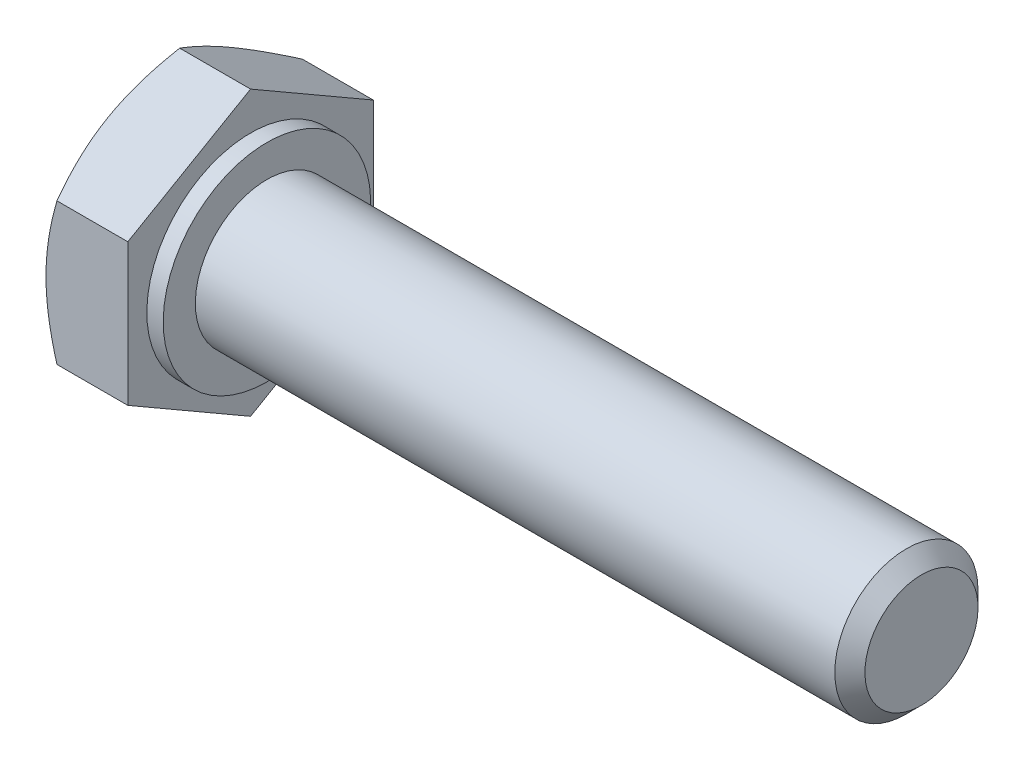
ISO-10303-21;
HEADER;
FILE_DESCRIPTION(('STEP AP214'),'2;1');
FILE_NAME('part.step','',(''),(''),'','','');
FILE_SCHEMA(('AUTOMOTIVE_DESIGN { 1 0 10303 214 1 1 1 1 }'));
ENDSEC;
DATA;
#1=APPLICATION_CONTEXT('core data for automotive mechanical design processes');
#2=APPLICATION_PROTOCOL_DEFINITION('international standard','automotive_design',2000,#1);
#3=PRODUCT_CONTEXT('',#1,'mechanical');
#4=PRODUCT('Part','Part','',(#3));
#5=PRODUCT_RELATED_PRODUCT_CATEGORY('part','',(#4));
#6=PRODUCT_DEFINITION_FORMATION('','',#4);
#7=PRODUCT_DEFINITION_CONTEXT('part definition',#1,'design');
#8=PRODUCT_DEFINITION('design','',#6,#7);
#9=PRODUCT_DEFINITION_SHAPE('','',#8);
#10=(LENGTH_UNIT() NAMED_UNIT(*) SI_UNIT(.MILLI.,.METRE.));
#11=(NAMED_UNIT(*) PLANE_ANGLE_UNIT() SI_UNIT($,.RADIAN.));
#12=(NAMED_UNIT(*) SI_UNIT($,.STERADIAN.) SOLID_ANGLE_UNIT());
#13=UNCERTAINTY_MEASURE_WITH_UNIT(LENGTH_MEASURE(1.E-05),#10,'distance_accuracy_value','');
#14=(GEOMETRIC_REPRESENTATION_CONTEXT(3) GLOBAL_UNCERTAINTY_ASSIGNED_CONTEXT((#13)) GLOBAL_UNIT_ASSIGNED_CONTEXT((#10,
#11,#12)) REPRESENTATION_CONTEXT('',''));
#15=CARTESIAN_POINT('',(0.,0.,0.));
#16=DIRECTION('',(0.,0.,1.));
#17=DIRECTION('',(1.,0.,0.));
#18=AXIS2_PLACEMENT_3D('',#15,#16,#17);
#19=CARTESIAN_POINT('',(0.,2.1425,0.));
#20=DIRECTION('',(1.,0.,0.));
#21=DIRECTION('',(0.,1.,0.));
#22=AXIS2_PLACEMENT_3D('',#19,#20,#21);
#23=PLANE('',#22);
#24=CARTESIAN_POINT('',(0.,0.,0.));
#25=DIRECTION('',(1.,0.,0.));
#26=DIRECTION('',(0.,1.,0.));
#27=AXIS2_PLACEMENT_3D('',#24,#25,#26);
#28=CIRCLE('',#27,1.75);
#29=CARTESIAN_POINT('',(0.,-1.75,0.));
#30=VERTEX_POINT('',#29);
#31=EDGE_CURVE('E207',#30,#30,#28,.T.);
#32=ORIENTED_EDGE('',*,*,#31,.F.);
#33=EDGE_LOOP('',(#32));
#34=FACE_BOUND('',#33,.T.);
#35=CARTESIAN_POINT('',(0.,0.,0.));
#36=DIRECTION('',(1.,0.,0.));
#37=DIRECTION('',(0.,1.,0.));
#38=AXIS2_PLACEMENT_3D('',#35,#36,#37);
#39=CIRCLE('',#38,2.535);
#40=CARTESIAN_POINT('',(0.,-2.535,0.));
#41=VERTEX_POINT('',#40);
#42=EDGE_CURVE('E30',#41,#41,#39,.T.);
#43=ORIENTED_EDGE('',*,*,#42,.T.);
#44=EDGE_LOOP('',(#43));
#45=FACE_BOUND('',#44,.T.);
#46=ADVANCED_FACE('F17',(#34,#45),#23,.T.);
#47=CARTESIAN_POINT('',(-0.200049999999994,0.,0.));
#48=DIRECTION('',(1.,0.,0.));
#49=DIRECTION('',(0.,1.,0.));
#50=AXIS2_PLACEMENT_3D('',#47,#48,#49);
#51=CYLINDRICAL_SURFACE('',#50,2.535);
#52=ORIENTED_EDGE('',*,*,#42,.F.);
#53=DIRECTION('',(-1.,0.,0.));
#54=VECTOR('',#53,1.);
#55=CARTESIAN_POINT('',(-0.200049999999994,-2.535,0.));
#56=LINE('',#55,#54);
#57=CARTESIAN_POINT('',(-0.400099999999995,-2.535,0.));
#58=VERTEX_POINT('',#57);
#59=EDGE_CURVE('E11',#41,#58,#56,.T.);
#60=ORIENTED_EDGE('',*,*,#59,.T.);
#61=CARTESIAN_POINT('',(-0.400099999999994,0.,0.));
#62=DIRECTION('',(1.,0.,0.));
#63=DIRECTION('',(0.,1.,0.));
#64=AXIS2_PLACEMENT_3D('',#61,#62,#63);
#65=CIRCLE('',#64,2.535);
#66=EDGE_CURVE('E231',#58,#58,#65,.T.);
#67=ORIENTED_EDGE('',*,*,#66,.T.);
#68=ORIENTED_EDGE('',*,*,#59,.F.);
#69=EDGE_LOOP('',(#52,#60,#67,#68));
#70=FACE_BOUND('',#69,.T.);
#71=ADVANCED_FACE('F376',(#70),#51,.T.);
#72=CARTESIAN_POINT('',(-2.4001,0.,0.));
#73=DIRECTION('',(1.,0.,0.));
#74=DIRECTION('',(0.,1.,0.));
#75=AXIS2_PLACEMENT_3D('',#72,#73,#74);
#76=PLANE('',#75);
#77=CARTESIAN_POINT('',(-2.4001,0.,0.));
#78=DIRECTION('',(-1.,0.,0.));
#79=DIRECTION('',(0.,1.,0.));
#80=AXIS2_PLACEMENT_3D('',#77,#78,#79);
#81=CIRCLE('',#80,3.);
#82=CARTESIAN_POINT('',(-2.4001,0.,3.));
#83=VERTEX_POINT('',#82);
#84=CARTESIAN_POINT('',(-2.4001,2.59807621135331,1.5));
#85=VERTEX_POINT('',#84);
#86=EDGE_CURVE('E187',#83,#85,#81,.T.);
#87=ORIENTED_EDGE('',*,*,#86,.T.);
#88=CARTESIAN_POINT('',(-2.4001,0.,0.));
#89=DIRECTION('',(-1.,0.,0.));
#90=DIRECTION('',(0.,1.,0.));
#91=AXIS2_PLACEMENT_3D('',#88,#89,#90);
#92=CIRCLE('',#91,3.);
#93=CARTESIAN_POINT('',(-2.4001,2.59807621135331,-1.5));
#94=VERTEX_POINT('',#93);
#95=EDGE_CURVE('E226',#85,#94,#92,.T.);
#96=ORIENTED_EDGE('',*,*,#95,.T.);
#97=CARTESIAN_POINT('',(-2.4001,0.,0.));
#98=DIRECTION('',(-1.,0.,0.));
#99=DIRECTION('',(0.,1.,0.));
#100=AXIS2_PLACEMENT_3D('',#97,#98,#99);
#101=CIRCLE('',#100,3.);
#102=CARTESIAN_POINT('',(-2.4001,0.,-3.));
#103=VERTEX_POINT('',#102);
#104=EDGE_CURVE('E263',#94,#103,#101,.T.);
#105=ORIENTED_EDGE('',*,*,#104,.T.);
#106=CARTESIAN_POINT('',(-2.4001,0.,0.));
#107=DIRECTION('',(-1.,0.,0.));
#108=DIRECTION('',(0.,1.,0.));
#109=AXIS2_PLACEMENT_3D('',#106,#107,#108);
#110=CIRCLE('',#109,3.);
#111=CARTESIAN_POINT('',(-2.4001,-2.59807621135331,-1.5));
#112=VERTEX_POINT('',#111);
#113=EDGE_CURVE('E173',#103,#112,#110,.T.);
#114=ORIENTED_EDGE('',*,*,#113,.T.);
#115=CARTESIAN_POINT('',(-2.4001,0.,0.));
#116=DIRECTION('',(-1.,0.,0.));
#117=DIRECTION('',(0.,1.,0.));
#118=AXIS2_PLACEMENT_3D('',#115,#116,#117);
#119=CIRCLE('',#118,3.);
#120=CARTESIAN_POINT('',(-2.4001,-2.59807621135331,1.5));
#121=VERTEX_POINT('',#120);
#122=EDGE_CURVE('E285',#112,#121,#119,.T.);
#123=ORIENTED_EDGE('',*,*,#122,.T.);
#124=CARTESIAN_POINT('',(-2.4001,0.,0.));
#125=DIRECTION('',(-1.,0.,0.));
#126=DIRECTION('',(0.,1.,0.));
#127=AXIS2_PLACEMENT_3D('',#124,#125,#126);
#128=CIRCLE('',#127,3.);
#129=EDGE_CURVE('E136',#121,#83,#128,.T.);
#130=ORIENTED_EDGE('',*,*,#129,.T.);
#131=EDGE_LOOP('',(#87,#96,#105,#114,#123,#130));
#132=FACE_BOUND('',#131,.T.);
#133=ADVANCED_FACE('F350',(#132),#76,.F.);
#134=CARTESIAN_POINT('',(-0.400099999999993,-3.46410161513775,0.));
#135=DIRECTION('',(0.,-0.866025403784439,-0.5));
#136=DIRECTION('',(0.,0.5,-0.866025403784439));
#137=AXIS2_PLACEMENT_3D('',#134,#135,#136);
#138=PLANE('',#137);
#139=CARTESIAN_POINT('',(-2.4001,-2.59807621135331,-1.5));
#140=CARTESIAN_POINT('',(-2.40010000000001,-2.19615242270664,-2.19615242270662));
#141=CARTESIAN_POINT('',(-2.1321508075689,-1.73205080756889,-3.));
#142=(BOUNDED_CURVE() B_SPLINE_CURVE(2,(#139,#140,#141),.UNSPECIFIED.,.F.,
.F.) B_SPLINE_CURVE_WITH_KNOTS((3,3),(0.17571291563257,0.35142583126514),
.UNSPECIFIED.) CURVE() GEOMETRIC_REPRESENTATION_ITEM() RATIONAL_B_SPLINE_CURVE((1.,
1.03795484930203,1.)) REPRESENTATION_ITEM(''));
#143=CARTESIAN_POINT('',(-2.1321508075689,-1.73205080756889,-3.));
#144=VERTEX_POINT('',#143);
#145=EDGE_CURVE('E179',#112,#144,#142,.T.);
#146=ORIENTED_EDGE('',*,*,#145,.T.);
#147=DIRECTION('',(-1.,0.,0.));
#148=VECTOR('',#147,1.);
#149=CARTESIAN_POINT('',(-0.400099999999993,-1.73205080756887,-3.));
#150=LINE('',#149,#148);
#151=CARTESIAN_POINT('',(-0.400099999999993,-1.73205080756887,-3.));
#152=VERTEX_POINT('',#151);
#153=EDGE_CURVE('E165',#152,#144,#150,.T.);
#154=ORIENTED_EDGE('',*,*,#153,.F.);
#155=DIRECTION('',(0.,0.5,-0.866025403784439));
#156=VECTOR('',#155,1.);
#157=CARTESIAN_POINT('',(-0.400099999999993,-3.46410161513775,0.));
#158=LINE('',#157,#156);
#159=CARTESIAN_POINT('',(-0.400099999999993,-3.46410161513775,0.));
#160=VERTEX_POINT('',#159);
#161=EDGE_CURVE('E161',#160,#152,#158,.T.);
#162=ORIENTED_EDGE('',*,*,#161,.F.);
#163=DIRECTION('',(-1.,0.,0.));
#164=VECTOR('',#163,1.);
#165=CARTESIAN_POINT('',(-0.400099999999993,-3.46410161513775,0.));
#166=LINE('',#165,#164);
#167=CARTESIAN_POINT('',(-2.1321508075689,-3.46410161513774,0.));
#168=VERTEX_POINT('',#167);
#169=EDGE_CURVE('E192',#160,#168,#166,.T.);
#170=ORIENTED_EDGE('',*,*,#169,.T.);
#171=CARTESIAN_POINT('',(-2.1321508075689,-3.46410161513774,0.));
#172=CARTESIAN_POINT('',(-2.40010000000001,-2.99999999999999,-0.803847577293378));
#173=CARTESIAN_POINT('',(-2.4001,-2.59807621135331,-1.5));
#174=(BOUNDED_CURVE() B_SPLINE_CURVE(2,(#171,#172,#173),.UNSPECIFIED.,.F.,
.F.) B_SPLINE_CURVE_WITH_KNOTS((3,3),(0.,0.17571291563257),
.UNSPECIFIED.) CURVE() GEOMETRIC_REPRESENTATION_ITEM() RATIONAL_B_SPLINE_CURVE((1.,
1.03795484930203,1.)) REPRESENTATION_ITEM(''));
#175=EDGE_CURVE('E264',#168,#112,#174,.T.);
#176=ORIENTED_EDGE('',*,*,#175,.T.);
#177=EDGE_LOOP('',(#146,#154,#162,#170,#176));
#178=FACE_BOUND('',#177,.T.);
#179=ADVANCED_FACE('F388',(#178),#138,.T.);
#180=CARTESIAN_POINT('',(-0.400099999999993,-1.73205080756888,3.));
#181=DIRECTION('',(0.,-0.866025403784439,0.5));
#182=DIRECTION('',(-1.,0.,0.));
#183=AXIS2_PLACEMENT_3D('',#180,#181,#182);
#184=PLANE('',#183);
#185=CARTESIAN_POINT('',(-2.4001,-2.59807621135331,1.5));
#186=CARTESIAN_POINT('',(-2.40010000000001,-2.99999999999999,0.803847577293377));
#187=CARTESIAN_POINT('',(-2.1321508075689,-3.46410161513774,0.));
#188=(BOUNDED_CURVE() B_SPLINE_CURVE(2,(#185,#186,#187),.UNSPECIFIED.,.F.,
.F.) B_SPLINE_CURVE_WITH_KNOTS((3,3),(0.17571291563257,0.35142583126514),
.UNSPECIFIED.) CURVE() GEOMETRIC_REPRESENTATION_ITEM() RATIONAL_B_SPLINE_CURVE((1.,
1.03795484930203,1.)) REPRESENTATION_ITEM(''));
#189=EDGE_CURVE('E272',#121,#168,#188,.T.);
#190=ORIENTED_EDGE('',*,*,#189,.T.);
#191=ORIENTED_EDGE('',*,*,#169,.F.);
#192=DIRECTION('',(0.,-0.5,-0.866025403784439));
#193=VECTOR('',#192,1.);
#194=CARTESIAN_POINT('',(-0.400099999999993,-1.73205080756888,3.));
#195=LINE('',#194,#193);
#196=CARTESIAN_POINT('',(-0.400099999999993,-1.73205080756888,3.));
#197=VERTEX_POINT('',#196);
#198=EDGE_CURVE('E199',#197,#160,#195,.T.);
#199=ORIENTED_EDGE('',*,*,#198,.F.);
#200=DIRECTION('',(-1.,0.,0.));
#201=VECTOR('',#200,1.);
#202=CARTESIAN_POINT('',(-0.400099999999993,-1.73205080756888,3.));
#203=LINE('',#202,#201);
#204=CARTESIAN_POINT('',(-2.1321508075689,-1.73205080756885,3.));
#205=VERTEX_POINT('',#204);
#206=EDGE_CURVE('E123',#197,#205,#203,.T.);
#207=ORIENTED_EDGE('',*,*,#206,.T.);
#208=CARTESIAN_POINT('',(-2.1321508075689,-1.73205080756889,3.));
#209=CARTESIAN_POINT('',(-2.40010000000001,-2.19615242270664,2.19615242270662));
#210=CARTESIAN_POINT('',(-2.4001,-2.59807621135331,1.5));
#211=(BOUNDED_CURVE() B_SPLINE_CURVE(2,(#208,#209,#210),.UNSPECIFIED.,.F.,
.F.) B_SPLINE_CURVE_WITH_KNOTS((3,3),(0.,0.17571291563257),
.UNSPECIFIED.) CURVE() GEOMETRIC_REPRESENTATION_ITEM() RATIONAL_B_SPLINE_CURVE((1.,
1.03795484930203,1.)) REPRESENTATION_ITEM(''));
#212=EDGE_CURVE('E183',#205,#121,#211,.T.);
#213=ORIENTED_EDGE('',*,*,#212,.T.);
#214=EDGE_LOOP('',(#190,#191,#199,#207,#213));
#215=FACE_BOUND('',#214,.T.);
#216=ADVANCED_FACE('F386',(#215),#184,.T.);
#217=CARTESIAN_POINT('',(-0.400099999999994,1.73205080756887,3.));
#218=DIRECTION('',(0.,0.,1.));
#219=DIRECTION('',(0.,-1.,0.));
#220=AXIS2_PLACEMENT_3D('',#217,#218,#219);
#221=PLANE('',#220);
#222=CARTESIAN_POINT('',(-2.4001,0.,3.));
#223=CARTESIAN_POINT('',(-2.40010000000001,-0.803847577293359,3.));
#224=CARTESIAN_POINT('',(-2.1321508075689,-1.73205080756885,3.));
#225=(BOUNDED_CURVE() B_SPLINE_CURVE(2,(#222,#223,#224),.UNSPECIFIED.,.F.,
.F.) B_SPLINE_CURVE_WITH_KNOTS((3,3),(0.17571291563257,0.35142583126514),
.UNSPECIFIED.) CURVE() GEOMETRIC_REPRESENTATION_ITEM() RATIONAL_B_SPLINE_CURVE((1.,
1.03795484930204,1.)) REPRESENTATION_ITEM(''));
#226=EDGE_CURVE('E209',#83,#205,#225,.T.);
#227=ORIENTED_EDGE('',*,*,#226,.T.);
#228=ORIENTED_EDGE('',*,*,#206,.F.);
#229=DIRECTION('',(0.,-1.,0.));
#230=VECTOR('',#229,1.);
#231=CARTESIAN_POINT('',(-0.400099999999994,1.73205080756887,3.));
#232=LINE('',#231,#230);
#233=CARTESIAN_POINT('',(-0.400099999999994,1.73205080756887,3.));
#234=VERTEX_POINT('',#233);
#235=EDGE_CURVE('E195',#234,#197,#232,.T.);
#236=ORIENTED_EDGE('',*,*,#235,.F.);
#237=DIRECTION('',(-1.,0.,0.));
#238=VECTOR('',#237,1.);
#239=CARTESIAN_POINT('',(-0.400099999999994,1.73205080756887,3.));
#240=LINE('',#239,#238);
#241=CARTESIAN_POINT('',(-2.1321508075689,1.73205080756884,3.));
#242=VERTEX_POINT('',#241);
#243=EDGE_CURVE('E154',#234,#242,#240,.T.);
#244=ORIENTED_EDGE('',*,*,#243,.T.);
#245=CARTESIAN_POINT('',(-2.1321508075689,1.73205080756884,3.));
#246=CARTESIAN_POINT('',(-2.40010000000001,0.803847577293353,3.));
#247=CARTESIAN_POINT('',(-2.4001,0.,3.));
#248=(BOUNDED_CURVE() B_SPLINE_CURVE(2,(#245,#246,#247),.UNSPECIFIED.,.F.,
.F.) B_SPLINE_CURVE_WITH_KNOTS((3,3),(0.,0.17571291563257),
.UNSPECIFIED.) CURVE() GEOMETRIC_REPRESENTATION_ITEM() RATIONAL_B_SPLINE_CURVE((1.,
1.03795484930205,1.)) REPRESENTATION_ITEM(''));
#249=EDGE_CURVE('E190',#242,#83,#248,.T.);
#250=ORIENTED_EDGE('',*,*,#249,.T.);
#251=EDGE_LOOP('',(#227,#228,#236,#244,#250));
#252=FACE_BOUND('',#251,.T.);
#253=ADVANCED_FACE('F346',(#252),#221,.T.);
#254=CARTESIAN_POINT('',(-0.400099999999993,0.,0.));
#255=DIRECTION('',(1.,0.,0.));
#256=DIRECTION('',(0.,1.,0.));
#257=AXIS2_PLACEMENT_3D('',#254,#255,#256);
#258=PLANE('',#257);
#259=ORIENTED_EDGE('',*,*,#66,.F.);
#260=EDGE_LOOP('',(#259));
#261=FACE_BOUND('',#260,.T.);
#262=DIRECTION('',(0.,-0.5,0.866025403784438));
#263=VECTOR('',#262,1.);
#264=CARTESIAN_POINT('',(-0.400099999999994,3.46410161513775,0.));
#265=LINE('',#264,#263);
#266=CARTESIAN_POINT('',(-0.400099999999994,3.46410161513775,0.));
#267=VERTEX_POINT('',#266);
#268=EDGE_CURVE('E200',#267,#234,#265,.T.);
#269=ORIENTED_EDGE('',*,*,#268,.T.);
#270=ORIENTED_EDGE('',*,*,#235,.T.);
#271=ORIENTED_EDGE('',*,*,#198,.T.);
#272=ORIENTED_EDGE('',*,*,#161,.T.);
#273=DIRECTION('',(0.,1.,0.));
#274=VECTOR('',#273,1.);
#275=CARTESIAN_POINT('',(-0.400099999999993,-1.73205080756887,-3.));
#276=LINE('',#275,#274);
#277=CARTESIAN_POINT('',(-0.400099999999994,1.73205080756888,-3.));
#278=VERTEX_POINT('',#277);
#279=EDGE_CURVE('E157',#152,#278,#276,.T.);
#280=ORIENTED_EDGE('',*,*,#279,.T.);
#281=DIRECTION('',(0.,0.5,0.866025403784439));
#282=VECTOR('',#281,1.);
#283=CARTESIAN_POINT('',(-0.400099999999994,1.73205080756888,-3.));
#284=LINE('',#283,#282);
#285=EDGE_CURVE('E143',#278,#267,#284,.T.);
#286=ORIENTED_EDGE('',*,*,#285,.T.);
#287=EDGE_LOOP('',(#269,#270,#271,#272,#280,#286));
#288=FACE_BOUND('',#287,.T.);
#289=ADVANCED_FACE('F158',(#261,#288),#258,.T.);
#290=CARTESIAN_POINT('',(-0.400099999999994,3.46410161513775,0.));
#291=DIRECTION('',(0.,0.866025403784438,0.5));
#292=DIRECTION('',(1.,0.,0.));
#293=AXIS2_PLACEMENT_3D('',#290,#291,#292);
#294=PLANE('',#293);
#295=CARTESIAN_POINT('',(-2.1321508075689,3.46410161513774,0.));
#296=CARTESIAN_POINT('',(-2.40010000000001,2.99999999999999,0.803847577293379));
#297=CARTESIAN_POINT('',(-2.4001,2.59807621135331,1.5));
#298=(BOUNDED_CURVE() B_SPLINE_CURVE(2,(#295,#296,#297),.UNSPECIFIED.,.F.,
.F.) B_SPLINE_CURVE_WITH_KNOTS((3,3),(0.,0.17571291563257),
.UNSPECIFIED.) CURVE() GEOMETRIC_REPRESENTATION_ITEM() RATIONAL_B_SPLINE_CURVE((1.,
1.03795484930203,1.)) REPRESENTATION_ITEM(''));
#299=CARTESIAN_POINT('',(-2.1321508075689,3.46410161513774,0.));
#300=VERTEX_POINT('',#299);
#301=EDGE_CURVE('E21',#300,#85,#298,.T.);
#302=ORIENTED_EDGE('',*,*,#301,.T.);
#303=CARTESIAN_POINT('',(-2.4001,2.59807621135331,1.5));
#304=CARTESIAN_POINT('',(-2.40010000000001,2.19615242270663,2.19615242270662));
#305=CARTESIAN_POINT('',(-2.1321508075689,1.73205080756889,3.));
#306=(BOUNDED_CURVE() B_SPLINE_CURVE(2,(#303,#304,#305),.UNSPECIFIED.,.F.,
.F.) B_SPLINE_CURVE_WITH_KNOTS((3,3),(0.17571291563257,0.35142583126514),
.UNSPECIFIED.) CURVE() GEOMETRIC_REPRESENTATION_ITEM() RATIONAL_B_SPLINE_CURVE((1.,
1.03795484930204,1.)) REPRESENTATION_ITEM(''));
#307=EDGE_CURVE('E191',#85,#242,#306,.T.);
#308=ORIENTED_EDGE('',*,*,#307,.T.);
#309=ORIENTED_EDGE('',*,*,#243,.F.);
#310=ORIENTED_EDGE('',*,*,#268,.F.);
#311=DIRECTION('',(-1.,0.,0.));
#312=VECTOR('',#311,1.);
#313=CARTESIAN_POINT('',(-0.400099999999994,3.46410161513775,0.));
#314=LINE('',#313,#312);
#315=EDGE_CURVE('E150',#267,#300,#314,.T.);
#316=ORIENTED_EDGE('',*,*,#315,.T.);
#317=EDGE_LOOP('',(#302,#308,#309,#310,#316));
#318=FACE_BOUND('',#317,.T.);
#319=ADVANCED_FACE('F392',(#318),#294,.T.);
#320=CARTESIAN_POINT('',(-0.400099999999994,1.73205080756888,-3.));
#321=DIRECTION('',(0.,0.866025403784439,-0.5));
#322=DIRECTION('',(-1.,0.,0.));
#323=AXIS2_PLACEMENT_3D('',#320,#321,#322);
#324=PLANE('',#323);
#325=CARTESIAN_POINT('',(-2.1321508075689,1.73205080756889,-3.));
#326=CARTESIAN_POINT('',(-2.40010000000001,2.19615242270664,-2.19615242270662));
#327=CARTESIAN_POINT('',(-2.4001,2.59807621135331,-1.5));
#328=(BOUNDED_CURVE() B_SPLINE_CURVE(2,(#325,#326,#327),.UNSPECIFIED.,.F.,
.F.) B_SPLINE_CURVE_WITH_KNOTS((3,3),(0.,0.17571291563257),
.UNSPECIFIED.) CURVE() GEOMETRIC_REPRESENTATION_ITEM() RATIONAL_B_SPLINE_CURVE((1.,
1.03795484930204,1.)) REPRESENTATION_ITEM(''));
#329=CARTESIAN_POINT('',(-2.1321508075689,1.73205080756885,-3.));
#330=VERTEX_POINT('',#329);
#331=EDGE_CURVE('E254',#330,#94,#328,.T.);
#332=ORIENTED_EDGE('',*,*,#331,.T.);
#333=CARTESIAN_POINT('',(-2.4001,2.59807621135331,-1.5));
#334=CARTESIAN_POINT('',(-2.40010000000001,2.99999999999999,-0.803847577293378));
#335=CARTESIAN_POINT('',(-2.1321508075689,3.46410161513774,0.));
#336=(BOUNDED_CURVE() B_SPLINE_CURVE(2,(#333,#334,#335),.UNSPECIFIED.,.F.,
.F.) B_SPLINE_CURVE_WITH_KNOTS((3,3),(0.17571291563257,0.35142583126514),
.UNSPECIFIED.) CURVE() GEOMETRIC_REPRESENTATION_ITEM() RATIONAL_B_SPLINE_CURVE((1.,
1.03795484930204,1.)) REPRESENTATION_ITEM(''));
#337=EDGE_CURVE('E222',#94,#300,#336,.T.);
#338=ORIENTED_EDGE('',*,*,#337,.T.);
#339=ORIENTED_EDGE('',*,*,#315,.F.);
#340=ORIENTED_EDGE('',*,*,#285,.F.);
#341=DIRECTION('',(-1.,0.,0.));
#342=VECTOR('',#341,1.);
#343=CARTESIAN_POINT('',(-0.400099999999994,1.73205080756888,-3.));
#344=LINE('',#343,#342);
#345=EDGE_CURVE('E147',#278,#330,#344,.T.);
#346=ORIENTED_EDGE('',*,*,#345,.T.);
#347=EDGE_LOOP('',(#332,#338,#339,#340,#346));
#348=FACE_BOUND('',#347,.T.);
#349=ADVANCED_FACE('F145',(#348),#324,.T.);
#350=CARTESIAN_POINT('',(-0.400099999999993,-1.73205080756887,-3.));
#351=DIRECTION('',(0.,0.,-1.));
#352=DIRECTION('',(-1.,0.,0.));
#353=AXIS2_PLACEMENT_3D('',#350,#351,#352);
#354=PLANE('',#353);
#355=CARTESIAN_POINT('',(-2.1321508075689,-1.73205080756885,-3.));
#356=CARTESIAN_POINT('',(-2.40010000000001,-0.803847577293356,-3.));
#357=CARTESIAN_POINT('',(-2.4001,0.,-3.));
#358=(BOUNDED_CURVE() B_SPLINE_CURVE(2,(#355,#356,#357),.UNSPECIFIED.,.F.,
.F.) B_SPLINE_CURVE_WITH_KNOTS((3,3),(0.,0.17571291563257),
.UNSPECIFIED.) CURVE() GEOMETRIC_REPRESENTATION_ITEM() RATIONAL_B_SPLINE_CURVE((1.,
1.03795484930204,1.)) REPRESENTATION_ITEM(''));
#359=EDGE_CURVE('E262',#144,#103,#358,.T.);
#360=ORIENTED_EDGE('',*,*,#359,.T.);
#361=CARTESIAN_POINT('',(-2.4001,0.,-3.));
#362=CARTESIAN_POINT('',(-2.40010000000001,0.803847577293357,-3.));
#363=CARTESIAN_POINT('',(-2.1321508075689,1.73205080756885,-3.));
#364=(BOUNDED_CURVE() B_SPLINE_CURVE(2,(#361,#362,#363),.UNSPECIFIED.,.F.,
.F.) B_SPLINE_CURVE_WITH_KNOTS((3,3),(0.17571291563257,0.35142583126514),
.UNSPECIFIED.) CURVE() GEOMETRIC_REPRESENTATION_ITEM() RATIONAL_B_SPLINE_CURVE((1.,
1.03795484930205,1.)) REPRESENTATION_ITEM(''));
#365=EDGE_CURVE('E171',#103,#330,#364,.T.);
#366=ORIENTED_EDGE('',*,*,#365,.T.);
#367=ORIENTED_EDGE('',*,*,#345,.F.);
#368=ORIENTED_EDGE('',*,*,#279,.F.);
#369=ORIENTED_EDGE('',*,*,#153,.T.);
#370=EDGE_LOOP('',(#360,#366,#367,#368,#369));
#371=FACE_BOUND('',#370,.T.);
#372=ADVANCED_FACE('F169',(#371),#354,.T.);
#373=CARTESIAN_POINT('',(-2.26612540378445,0.,0.));
#374=DIRECTION('',(1.,0.,0.));
#375=DIRECTION('',(0.,1.,0.));
#376=AXIS2_PLACEMENT_3D('',#373,#374,#375);
#377=CONICAL_SURFACE('',#376,3.23205080756887,1.0471975511966);
#378=ORIENTED_EDGE('',*,*,#359,.F.);
#379=ORIENTED_EDGE('',*,*,#145,.F.);
#380=ORIENTED_EDGE('',*,*,#113,.F.);
#381=EDGE_LOOP('',(#378,#379,#380));
#382=FACE_BOUND('',#381,.T.);
#383=ADVANCED_FACE('F361',(#382),#377,.T.);
#384=CARTESIAN_POINT('',(-2.26612540378445,0.,0.));
#385=DIRECTION('',(1.,0.,0.));
#386=DIRECTION('',(0.,1.,0.));
#387=AXIS2_PLACEMENT_3D('',#384,#385,#386);
#388=CONICAL_SURFACE('',#387,3.23205080756887,1.0471975511966);
#389=ORIENTED_EDGE('',*,*,#365,.F.);
#390=ORIENTED_EDGE('',*,*,#104,.F.);
#391=ORIENTED_EDGE('',*,*,#331,.F.);
#392=EDGE_LOOP('',(#389,#390,#391));
#393=FACE_BOUND('',#392,.T.);
#394=ADVANCED_FACE('F358',(#393),#388,.T.);
#395=CARTESIAN_POINT('',(-2.26612540378445,0.,0.));
#396=DIRECTION('',(1.,0.,0.));
#397=DIRECTION('',(0.,-1.,0.));
#398=AXIS2_PLACEMENT_3D('',#395,#396,#397);
#399=CONICAL_SURFACE('',#398,3.23205080756887,1.0471975511966);
#400=ORIENTED_EDGE('',*,*,#175,.F.);
#401=ORIENTED_EDGE('',*,*,#189,.F.);
#402=ORIENTED_EDGE('',*,*,#122,.F.);
#403=EDGE_LOOP('',(#400,#401,#402));
#404=FACE_BOUND('',#403,.T.);
#405=ADVANCED_FACE('F360',(#404),#399,.T.);
#406=CARTESIAN_POINT('',(-2.26612540378445,0.,0.));
#407=DIRECTION('',(1.,0.,0.));
#408=DIRECTION('',(0.,1.,0.));
#409=AXIS2_PLACEMENT_3D('',#406,#407,#408);
#410=CONICAL_SURFACE('',#409,3.23205080756887,1.0471975511966);
#411=ORIENTED_EDGE('',*,*,#337,.F.);
#412=ORIENTED_EDGE('',*,*,#95,.F.);
#413=ORIENTED_EDGE('',*,*,#301,.F.);
#414=EDGE_LOOP('',(#411,#412,#413));
#415=FACE_BOUND('',#414,.T.);
#416=ADVANCED_FACE('F356',(#415),#410,.T.);
#417=CARTESIAN_POINT('',(-2.26612540378445,0.,0.));
#418=DIRECTION('',(1.,0.,0.));
#419=DIRECTION('',(0.,1.,0.));
#420=AXIS2_PLACEMENT_3D('',#417,#418,#419);
#421=CONICAL_SURFACE('',#420,3.23205080756887,1.0471975511966);
#422=ORIENTED_EDGE('',*,*,#212,.F.);
#423=ORIENTED_EDGE('',*,*,#226,.F.);
#424=ORIENTED_EDGE('',*,*,#129,.F.);
#425=EDGE_LOOP('',(#422,#423,#424));
#426=FACE_BOUND('',#425,.T.);
#427=ADVANCED_FACE('F396',(#426),#421,.T.);
#428=CARTESIAN_POINT('',(-2.26612540378445,0.,0.));
#429=DIRECTION('',(1.,0.,0.));
#430=DIRECTION('',(0.,1.,0.));
#431=AXIS2_PLACEMENT_3D('',#428,#429,#430);
#432=CONICAL_SURFACE('',#431,3.23205080756887,1.0471975511966);
#433=ORIENTED_EDGE('',*,*,#307,.F.);
#434=ORIENTED_EDGE('',*,*,#86,.F.);
#435=ORIENTED_EDGE('',*,*,#249,.F.);
#436=EDGE_LOOP('',(#433,#434,#435));
#437=FACE_BOUND('',#436,.T.);
#438=ADVANCED_FACE('F349',(#437),#432,.T.);
#439=CARTESIAN_POINT('',(16.,0.875,0.));
#440=DIRECTION('',(1.,0.,0.));
#441=DIRECTION('',(0.,1.,0.));
#442=AXIS2_PLACEMENT_3D('',#439,#440,#441);
#443=PLANE('',#442);
#444=CARTESIAN_POINT('',(16.,0.,0.));
#445=DIRECTION('',(-1.,0.,0.));
#446=DIRECTION('',(0.,-1.,0.));
#447=AXIS2_PLACEMENT_3D('',#444,#445,#446);
#448=CIRCLE('',#447,1.38193);
#449=CARTESIAN_POINT('',(16.,1.38193,0.));
#450=VERTEX_POINT('',#449);
#451=EDGE_CURVE('E214',#450,#450,#448,.T.);
#452=ORIENTED_EDGE('',*,*,#451,.F.);
#453=EDGE_LOOP('',(#452));
#454=FACE_BOUND('',#453,.T.);
#455=ADVANCED_FACE('F398',(#454),#443,.T.);
#456=CARTESIAN_POINT('',(8.9,0.,0.));
#457=DIRECTION('',(1.,0.,0.));
#458=DIRECTION('',(0.,1.,0.));
#459=AXIS2_PLACEMENT_3D('',#456,#457,#458);
#460=CYLINDRICAL_SURFACE('',#459,1.75);
#461=CARTESIAN_POINT('',(15.63183,0.,0.));
#462=DIRECTION('',(1.,0.,0.));
#463=DIRECTION('',(0.,-1.,0.));
#464=AXIS2_PLACEMENT_3D('',#461,#462,#463);
#465=CIRCLE('',#464,1.75);
#466=CARTESIAN_POINT('',(15.63183,1.75,0.));
#467=VERTEX_POINT('',#466);
#468=CARTESIAN_POINT('',(15.63183,-1.75,0.));
#469=VERTEX_POINT('',#468);
#470=EDGE_CURVE('E289',#467,#469,#465,.T.);
#471=ORIENTED_EDGE('',*,*,#470,.F.);
#472=CARTESIAN_POINT('',(15.63183,0.,0.));
#473=DIRECTION('',(1.,0.,0.));
#474=DIRECTION('',(0.,-1.,0.));
#475=AXIS2_PLACEMENT_3D('',#472,#473,#474);
#476=CIRCLE('',#475,1.75);
#477=EDGE_CURVE('E208',#469,#467,#476,.T.);
#478=ORIENTED_EDGE('',*,*,#477,.F.);
#479=DIRECTION('',(-1.,0.,0.));
#480=VECTOR('',#479,1.);
#481=CARTESIAN_POINT('',(8.9,-1.75,0.));
#482=LINE('',#481,#480);
#483=EDGE_CURVE('E203',#469,#30,#482,.T.);
#484=ORIENTED_EDGE('',*,*,#483,.T.);
#485=ORIENTED_EDGE('',*,*,#31,.T.);
#486=ORIENTED_EDGE('',*,*,#483,.F.);
#487=EDGE_LOOP('',(#471,#478,#484,#485,#486));
#488=FACE_BOUND('',#487,.T.);
#489=ADVANCED_FACE('F555',(#488),#460,.T.);
#490=CARTESIAN_POINT('',(15.815915,0.,0.));
#491=DIRECTION('',(-1.,0.,0.));
#492=DIRECTION('',(0.,-1.,0.));
#493=AXIS2_PLACEMENT_3D('',#490,#491,#492);
#494=CONICAL_SURFACE('',#493,1.565965,0.785262338123914);
#495=ORIENTED_EDGE('',*,*,#451,.T.);
#496=DIRECTION('',(-0.707202817635693,0.707010731692339,0.));
#497=VECTOR('',#496,1.);
#498=CARTESIAN_POINT('',(15.815915,1.565965,0.));
#499=LINE('',#498,#497);
#500=EDGE_CURVE('E221',#450,#467,#499,.T.);
#501=ORIENTED_EDGE('',*,*,#500,.T.);
#502=ORIENTED_EDGE('',*,*,#470,.T.);
#503=ORIENTED_EDGE('',*,*,#477,.T.);
#504=ORIENTED_EDGE('',*,*,#500,.F.);
#505=EDGE_LOOP('',(#495,#501,#502,#503,#504));
#506=FACE_BOUND('',#505,.T.);
#507=ADVANCED_FACE('F19',(#506),#494,.T.);
#508=CLOSED_SHELL('',(#46,#71,#133,#179,#216,#253,#289,#319,#349,#372,#383,#394,#405,#416,#427,
#438,#455,#489,#507));
#509=MANIFOLD_SOLID_BREP('B1',#508);
#510=ADVANCED_BREP_SHAPE_REPRESENTATION('',(#18,#509),#14);
#511=SHAPE_DEFINITION_REPRESENTATION(#9,#510);
ENDSEC;
END-ISO-10303-21;
